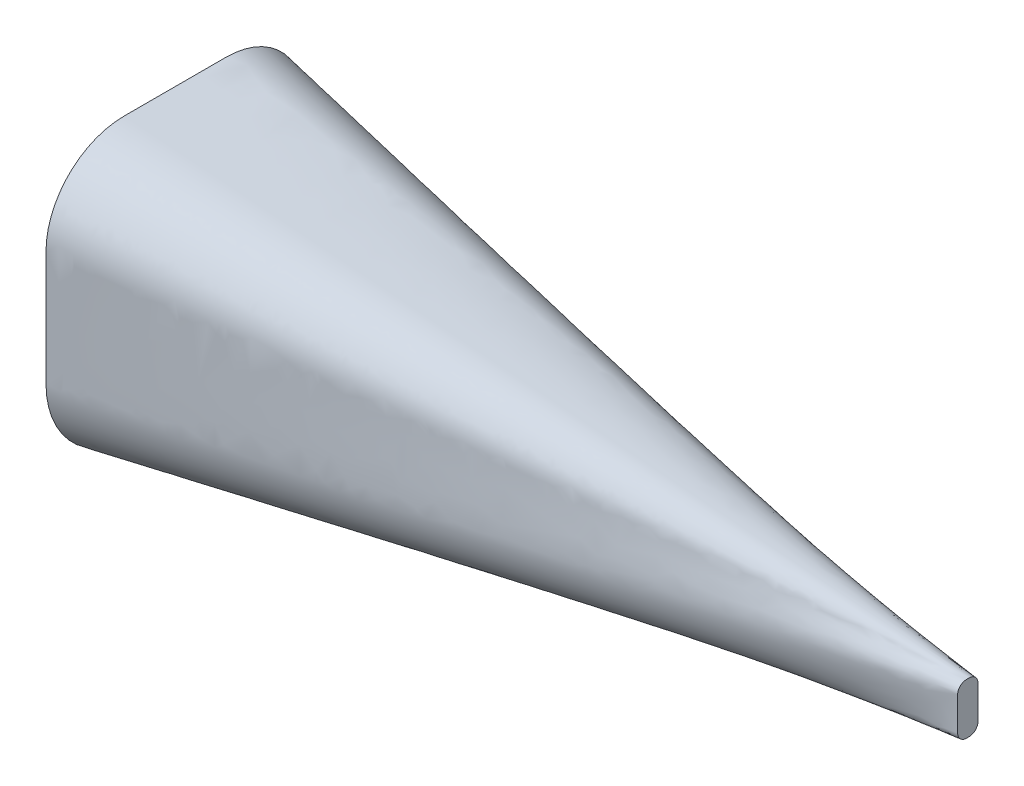
ISO-10303-21;
HEADER;
FILE_DESCRIPTION(('STEP AP214'),'2;1');
FILE_NAME('part.step','',(''),(''),'','','');
FILE_SCHEMA(('AUTOMOTIVE_DESIGN { 1 0 10303 214 1 1 1 1 }'));
ENDSEC;
DATA;
#1=APPLICATION_CONTEXT('core data for automotive mechanical design processes');
#2=APPLICATION_PROTOCOL_DEFINITION('international standard','automotive_design',2000,#1);
#3=PRODUCT_CONTEXT('',#1,'mechanical');
#4=PRODUCT('Part','Part','',(#3));
#5=PRODUCT_RELATED_PRODUCT_CATEGORY('part','',(#4));
#6=PRODUCT_DEFINITION_FORMATION('','',#4);
#7=PRODUCT_DEFINITION_CONTEXT('part definition',#1,'design');
#8=PRODUCT_DEFINITION('design','',#6,#7);
#9=PRODUCT_DEFINITION_SHAPE('','',#8);
#10=(LENGTH_UNIT() NAMED_UNIT(*) SI_UNIT(.MILLI.,.METRE.));
#11=(NAMED_UNIT(*) PLANE_ANGLE_UNIT() SI_UNIT($,.RADIAN.));
#12=(NAMED_UNIT(*) SI_UNIT($,.STERADIAN.) SOLID_ANGLE_UNIT());
#13=UNCERTAINTY_MEASURE_WITH_UNIT(LENGTH_MEASURE(1.E-05),#10,'distance_accuracy_value','');
#14=(GEOMETRIC_REPRESENTATION_CONTEXT(3) GLOBAL_UNCERTAINTY_ASSIGNED_CONTEXT((#13)) GLOBAL_UNIT_ASSIGNED_CONTEXT((#10,
#11,#12)) REPRESENTATION_CONTEXT('',''));
#15=CARTESIAN_POINT('',(0.,0.,0.));
#16=DIRECTION('',(0.,0.,1.));
#17=DIRECTION('',(1.,0.,0.));
#18=AXIS2_PLACEMENT_3D('',#15,#16,#17);
#19=CARTESIAN_POINT('',(311.404001016,-6.56399981681864,-0.88399890091182));
#20=DIRECTION('',(1.,0.,0.));
#21=DIRECTION('',(0.,0.,-1.));
#22=AXIS2_PLACEMENT_3D('',#19,#20,#21);
#23=PLANE('',#22);
#24=CARTESIAN_POINT('',(311.404001016,-6.56399981681864,-0.88399890091182));
#25=DIRECTION('',(1.,0.,0.));
#26=DIRECTION('',(0.,0.,-1.));
#27=AXIS2_PLACEMENT_3D('',#24,#25,#26);
#28=CIRCLE('',#27,3.5);
#29=CARTESIAN_POINT('',(311.404001016,-10.0639998168186,-0.88399890091182));
#30=VERTEX_POINT('',#29);
#31=CARTESIAN_POINT('',(311.404001016,-6.56399981683067,-4.38399890091182));
#32=VERTEX_POINT('',#31);
#33=EDGE_CURVE('E359',#30,#32,#28,.T.);
#34=ORIENTED_EDGE('',*,*,#33,.T.);
#35=DIRECTION('',(0.,1.,0.));
#36=VECTOR('',#35,1.);
#37=CARTESIAN_POINT('',(311.404001016,6.43600018318136,-4.38399890091182));
#38=LINE('',#37,#36);
#39=CARTESIAN_POINT('',(311.404001016,6.43600018317641,-4.38399890091182));
#40=VERTEX_POINT('',#39);
#41=EDGE_CURVE('E619',#32,#40,#38,.T.);
#42=ORIENTED_EDGE('',*,*,#41,.T.);
#43=CARTESIAN_POINT('',(311.404001016,6.43600018318136,-0.883998900911818));
#44=DIRECTION('',(1.,0.,0.));
#45=DIRECTION('',(0.,0.,1.));
#46=AXIS2_PLACEMENT_3D('',#43,#44,#45);
#47=CIRCLE('',#46,3.5);
#48=CARTESIAN_POINT('',(311.404001016,9.93600018318135,-0.88399890085726));
#49=VERTEX_POINT('',#48);
#50=EDGE_CURVE('E609',#40,#49,#47,.T.);
#51=ORIENTED_EDGE('',*,*,#50,.T.);
#52=DIRECTION('',(0.,0.,1.));
#53=VECTOR('',#52,1.);
#54=CARTESIAN_POINT('',(311.404001016,9.93600018318136,0.116001099088183));
#55=LINE('',#54,#53);
#56=CARTESIAN_POINT('',(311.404001016,9.93600018318136,0.11600109908024));
#57=VERTEX_POINT('',#56);
#58=EDGE_CURVE('E599',#49,#57,#55,.T.);
#59=ORIENTED_EDGE('',*,*,#58,.T.);
#60=CARTESIAN_POINT('',(311.404001016,6.43600018318136,0.116001099088182));
#61=DIRECTION('',(1.,0.,0.));
#62=DIRECTION('',(0.,0.,-1.));
#63=AXIS2_PLACEMENT_3D('',#60,#61,#62);
#64=CIRCLE('',#63,3.5);
#65=CARTESIAN_POINT('',(311.404001016,6.43600018334445,3.61600109908818));
#66=VERTEX_POINT('',#65);
#67=EDGE_CURVE('E589',#57,#66,#64,.T.);
#68=ORIENTED_EDGE('',*,*,#67,.T.);
#69=DIRECTION('',(0.,-1.,0.));
#70=VECTOR('',#69,1.);
#71=CARTESIAN_POINT('',(311.404001016,6.43600018318136,3.61600109908818));
#72=LINE('',#71,#70);
#73=CARTESIAN_POINT('',(311.404001016,-6.5639998168176,3.61600109908818));
#74=VERTEX_POINT('',#73);
#75=EDGE_CURVE('E579',#66,#74,#72,.T.);
#76=ORIENTED_EDGE('',*,*,#75,.T.);
#77=CARTESIAN_POINT('',(311.404001016,-6.56399981681864,0.11600109908818));
#78=DIRECTION('',(1.,0.,0.));
#79=DIRECTION('',(0.,0.,-1.));
#80=AXIS2_PLACEMENT_3D('',#77,#78,#79);
#81=CIRCLE('',#80,3.5);
#82=CARTESIAN_POINT('',(311.404001016,-10.0639998168186,0.11600109908818));
#83=VERTEX_POINT('',#82);
#84=EDGE_CURVE('E284',#74,#83,#81,.T.);
#85=ORIENTED_EDGE('',*,*,#84,.T.);
#86=DIRECTION('',(0.,0.,-1.));
#87=VECTOR('',#86,1.);
#88=CARTESIAN_POINT('',(311.404001016,-10.0639998168186,0.11600109908818));
#89=LINE('',#88,#87);
#90=EDGE_CURVE('E12',#83,#30,#89,.T.);
#91=ORIENTED_EDGE('',*,*,#90,.T.);
#92=EDGE_LOOP('',(#34,#42,#51,#59,#68,#76,#85,#91));
#93=FACE_BOUND('',#92,.T.);
#94=ADVANCED_FACE('F273',(#93),#23,.T.);
#95=CARTESIAN_POINT('',(0.,24.9360001831814,19.6160010990882));
#96=DIRECTION('',(-1.,0.,0.));
#97=DIRECTION('',(0.,0.,1.));
#98=AXIS2_PLACEMENT_3D('',#95,#96,#97);
#99=PLANE('',#98);
#100=CARTESIAN_POINT('',(0.,24.9360001831814,19.6160010990882));
#101=DIRECTION('',(1.,0.,0.));
#102=DIRECTION('',(0.,0.,1.));
#103=AXIS2_PLACEMENT_3D('',#100,#101,#102);
#104=CIRCLE('',#103,30.7);
#105=CARTESIAN_POINT('',(0.,55.6360001831814,19.6160010983524));
#106=VERTEX_POINT('',#105);
#107=CARTESIAN_POINT('',(0.,24.9360001831814,50.3160010990882));
#108=VERTEX_POINT('',#107);
#109=EDGE_CURVE('E351',#106,#108,#104,.T.);
#110=ORIENTED_EDGE('',*,*,#109,.F.);
#111=DIRECTION('',(0.,0.,1.));
#112=VECTOR('',#111,1.);
#113=CARTESIAN_POINT('',(0.,55.6360001831814,19.6160010990882));
#114=LINE('',#113,#112);
#115=CARTESIAN_POINT('',(0.,55.6360001831814,-20.3839989011873));
#116=VERTEX_POINT('',#115);
#117=EDGE_CURVE('E365',#116,#106,#114,.T.);
#118=ORIENTED_EDGE('',*,*,#117,.F.);
#119=CARTESIAN_POINT('',(0.,24.9360001831814,-20.3839989009118));
#120=DIRECTION('',(1.,0.,0.));
#121=DIRECTION('',(0.,0.,1.));
#122=AXIS2_PLACEMENT_3D('',#119,#120,#121);
#123=CIRCLE('',#122,30.7);
#124=CARTESIAN_POINT('',(0.,24.9360001828926,-51.0839989009118));
#125=VERTEX_POINT('',#124);
#126=EDGE_CURVE('E544',#125,#116,#123,.T.);
#127=ORIENTED_EDGE('',*,*,#126,.F.);
#128=DIRECTION('',(0.,1.,0.));
#129=VECTOR('',#128,1.);
#130=CARTESIAN_POINT('',(0.,24.9360001831814,-51.0839989009118));
#131=LINE('',#130,#129);
#132=CARTESIAN_POINT('',(0.,-20.0639998186042,-51.0839989009118));
#133=VERTEX_POINT('',#132);
#134=EDGE_CURVE('E534',#133,#125,#131,.T.);
#135=ORIENTED_EDGE('',*,*,#134,.F.);
#136=CARTESIAN_POINT('',(0.,-20.0639998168186,-15.3839989009118));
#137=DIRECTION('',(1.,0.,0.));
#138=DIRECTION('',(0.,0.,-1.));
#139=AXIS2_PLACEMENT_3D('',#136,#137,#138);
#140=CIRCLE('',#139,35.7);
#141=CARTESIAN_POINT('',(0.,-55.7639998168187,-15.3839989034915));
#142=VERTEX_POINT('',#141);
#143=EDGE_CURVE('E524',#142,#133,#140,.T.);
#144=ORIENTED_EDGE('',*,*,#143,.F.);
#145=DIRECTION('',(0.,0.,-1.));
#146=VECTOR('',#145,1.);
#147=CARTESIAN_POINT('',(0.,-55.7639998168186,-0.883998900911824));
#148=LINE('',#147,#146);
#149=CARTESIAN_POINT('',(0.,-55.7639998168187,-0.883998900911825));
#150=VERTEX_POINT('',#149);
#151=EDGE_CURVE('E514',#150,#142,#148,.T.);
#152=ORIENTED_EDGE('',*,*,#151,.F.);
#153=DIRECTION('',(0.,0.,-1.));
#154=VECTOR('',#153,1.);
#155=CARTESIAN_POINT('',(0.,-55.7639998168186,0.116001099088176));
#156=LINE('',#155,#154);
#157=CARTESIAN_POINT('',(0.,-55.7639998168186,0.116001099088176));
#158=VERTEX_POINT('',#157);
#159=EDGE_CURVE('E504',#158,#150,#156,.T.);
#160=ORIENTED_EDGE('',*,*,#159,.F.);
#161=DIRECTION('',(0.,0.,-1.));
#162=VECTOR('',#161,1.);
#163=CARTESIAN_POINT('',(0.,-55.7639998168186,14.6160010990882));
#164=LINE('',#163,#162);
#165=CARTESIAN_POINT('',(0.,-55.7639998168187,14.6160011003056));
#166=VERTEX_POINT('',#165);
#167=EDGE_CURVE('E497',#166,#158,#164,.T.);
#168=ORIENTED_EDGE('',*,*,#167,.F.);
#169=CARTESIAN_POINT('',(0.,-20.0639998168186,14.6160010990882));
#170=DIRECTION('',(1.,0.,0.));
#171=DIRECTION('',(0.,0.,-1.));
#172=AXIS2_PLACEMENT_3D('',#169,#170,#171);
#173=CIRCLE('',#172,35.7);
#174=CARTESIAN_POINT('',(0.,-20.0639998168186,50.3160010990882));
#175=VERTEX_POINT('',#174);
#176=EDGE_CURVE('E354',#175,#166,#173,.T.);
#177=ORIENTED_EDGE('',*,*,#176,.F.);
#178=DIRECTION('',(0.,-1.,0.));
#179=VECTOR('',#178,1.);
#180=CARTESIAN_POINT('',(0.,24.9360001831814,50.3160010990882));
#181=LINE('',#180,#179);
#182=EDGE_CURVE('E346',#108,#175,#181,.T.);
#183=ORIENTED_EDGE('',*,*,#182,.F.);
#184=EDGE_LOOP('',(#110,#118,#127,#135,#144,#152,#160,#168,#177,#183));
#185=FACE_BOUND('',#184,.T.);
#186=ADVANCED_FACE('F349',(#185),#99,.T.);
#187=CARTESIAN_POINT('',(0.,55.6360001831814,19.6160010918265));
#188=CARTESIAN_POINT('',(311.404001016,9.93600018318135,-0.883998900376984));
#189=CARTESIAN_POINT('',(0.,55.6360001831814,21.1172626836924));
#190=CARTESIAN_POINT('',(311.404001016,9.93600018318135,-0.773428767989582));
#191=CARTESIAN_POINT('',(0.,55.4179480152652,24.3292082338783));
#192=CARTESIAN_POINT('',(311.404001016,9.93600018318136,-0.650294084213661));
#193=CARTESIAN_POINT('',(0.,54.113023077654,29.7822612987783));
#194=CARTESIAN_POINT('',(311.404001016,9.93600018318136,-0.593014915437986));
#195=CARTESIAN_POINT('',(0.,51.8489970573362,34.698368719816));
#196=CARTESIAN_POINT('',(311.404001016,9.93600018318136,-0.512639747767226));
#197=CARTESIAN_POINT('',(0.,49.1972574457168,38.5392431624443));
#198=CARTESIAN_POINT('',(311.404001016,9.93600018318135,-0.439155094986588));
#199=CARTESIAN_POINT('',(0.,46.8252125563963,41.2429437548197));
#200=CARTESIAN_POINT('',(311.404001016,9.93600018318135,-0.382049595471743));
#201=CARTESIAN_POINT('',(0.,44.1378804877398,43.6592013932662));
#202=CARTESIAN_POINT('',(311.404001016,9.93600018318135,-0.325552335420178));
#203=CARTESIAN_POINT('',(0.,41.2529821052288,45.6972140012147));
#204=CARTESIAN_POINT('',(311.404001016,9.93600018318136,-0.271558327443118));
#205=CARTESIAN_POINT('',(0.,38.2936695892195,47.3228344516589));
#206=CARTESIAN_POINT('',(311.404001016,9.93600018318136,-0.221962584151784));
#207=CARTESIAN_POINT('',(0.,34.3783664426568,48.9553005208935));
#208=CARTESIAN_POINT('',(311.404001016,9.93600018318136,-0.164225962825938));
#209=CARTESIAN_POINT('',(0.,29.741936168367,50.0906970161156));
#210=CARTESIAN_POINT('',(311.404001016,9.93600018318136,-0.112525910939065));
#211=CARTESIAN_POINT('',(0.,26.4661446776803,50.3160010990882));
#212=CARTESIAN_POINT('',(311.404001016,9.93600018318136,0.00934817448254277));
#213=CARTESIAN_POINT('',(0.,20.2276685893745,50.3160010990882));
#214=CARTESIAN_POINT('',(311.404001016,9.93600018318136,0.44417750972343));
#215=CARTESIAN_POINT('',(0.,11.4440294171231,50.3160010990882));
#216=CARTESIAN_POINT('',(311.404001016001,9.84542731613543,1.15404075861435));
#217=CARTESIAN_POINT('',(0.,1.71873522188847,50.3160010990882));
#218=CARTESIAN_POINT('',(311.404001015999,9.37338144474158,2.11783336469917));
#219=CARTESIAN_POINT('',(0.,-5.46136570008985,50.3160010990882));
#220=CARTESIAN_POINT('',(311.404001016001,8.70102246567916,2.82003225085521));
#221=CARTESIAN_POINT('',(0.,-10.5751869493449,50.3160010990882));
#222=CARTESIAN_POINT('',(311.404001016,8.04959463818193,3.25653805968334));
#223=CARTESIAN_POINT('',(0.,-15.4465665312474,50.3160010990882));
#224=CARTESIAN_POINT('',(311.404001016,7.27358552322974,3.54902387999788));
#225=CARTESIAN_POINT('',(0.,-18.5469762987374,50.3160010990882));
#226=CARTESIAN_POINT('',(311.404001016,6.71362475536981,3.61600109908818));
#227=CARTESIAN_POINT('',(0.,-22.7585358173125,50.3160010990882));
#228=CARTESIAN_POINT('',(311.404001016,5.94288362618528,3.61600109908818));
#229=CARTESIAN_POINT('',(0.,-27.8862255427362,49.7124887519101));
#230=CARTESIAN_POINT('',(311.404001016,4.93444238733296,3.61600109908818));
#231=CARTESIAN_POINT('',(0.,-34.7753841898454,47.4001178820949));
#232=CARTESIAN_POINT('',(311.404001016,3.36223677098733,3.61600109908818));
#233=CARTESIAN_POINT('',(0.,-40.8202542089141,43.9301233511671));
#234=CARTESIAN_POINT('',(311.404001016,1.73756801308794,3.61600109908818));
#235=CARTESIAN_POINT('',(0.,-45.9668730352458,39.488913611288));
#236=CARTESIAN_POINT('',(311.404001016,0.0763936015578786,3.61600109908818));
#237=CARTESIAN_POINT('',(0.,-50.1488466266007,34.2218590494992));
#238=CARTESIAN_POINT('',(311.404001016,-1.60532897567978,3.61600109908818));
#239=CARTESIAN_POINT('',(0.,-53.2867297095918,28.2548589620298));
#240=CARTESIAN_POINT('',(311.404001016,-3.28701961648492,3.61600109908818));
#241=CARTESIAN_POINT('',(0.,-55.2811609496783,21.702237884448));
#242=CARTESIAN_POINT('',(311.404001016,-4.94809821871743,3.61600109908818));
#243=CARTESIAN_POINT('',(0.,-55.7639998168186,17.017775097319));
#244=CARTESIAN_POINT('',(311.404001016,-6.0311777815924,3.61600109908818));
#245=CARTESIAN_POINT('',(0.,-55.7639998168186,13.5380967212564));
#246=CARTESIAN_POINT('',(311.404001016,-6.80312772595073,3.61600109908818));
#247=CARTESIAN_POINT('',(0.,-55.7639998168187,11.2768080474479));
#248=CARTESIAN_POINT('',(311.404001016,-7.26100596733774,3.56758981031648));
#249=CARTESIAN_POINT('',(0.,-55.7639998168186,7.61480858879069));
#250=CARTESIAN_POINT('',(311.404001016,-7.89259839105827,3.37578598045451));
#251=CARTESIAN_POINT('',(0.,-55.7639998168187,3.81633878855292));
#252=CARTESIAN_POINT('',(311.404001016,-8.46851579675643,3.07618088471527));
#253=CARTESIAN_POINT('',(0.,-55.7639998168186,1.32433443242151));
#254=CARTESIAN_POINT('',(311.404001016,-8.81261491286521,2.80723970314582));
#255=CARTESIAN_POINT('',(0.,-55.7639998168187,0.0326677657548427));
#256=CARTESIAN_POINT('',(311.404001016,-8.98431848144502,2.64429910058508));
#257=CARTESIAN_POINT('',(0.,-55.7639998168187,-0.133998900911827));
#258=CARTESIAN_POINT('',(311.404001016,-9.00633617342354,2.62312949853887));
#259=CARTESIAN_POINT('',(0.,-55.7639998168186,-0.383998900911818));
#260=CARTESIAN_POINT('',(311.404001016,-9.03894422915591,2.59094551142546));
#261=CARTESIAN_POINT('',(0.,-55.7639998168187,-0.633998900911825));
#262=CARTESIAN_POINT('',(311.404001016,-9.07112821626934,2.55833745569306));
#263=CARTESIAN_POINT('',(0.,-55.7639998168187,-0.800665567578492));
#264=CARTESIAN_POINT('',(311.404001016,-9.09229781831555,2.53631976371455));
#265=CARTESIAN_POINT('',(0.,-55.7639998168186,-1.48816556757849));
#266=CARTESIAN_POINT('',(311.404001016,-9.17902426811897,2.44492915457553));
#267=CARTESIAN_POINT('',(0.,-55.7639998168186,-2.64594909213407));
#268=CARTESIAN_POINT('',(311.404001016,-9.33282919017626,2.26721981685514));
#269=CARTESIAN_POINT('',(0.,-55.7639998168186,-4.27674955636454));
#270=CARTESIAN_POINT('',(311.404001016,-9.55229902720466,1.95287914777894));
#271=CARTESIAN_POINT('',(0.,-55.7639998168186,-5.84744980172239));
#272=CARTESIAN_POINT('',(311.404001016,-9.73926747978968,1.60436228664293));
#273=CARTESIAN_POINT('',(0.,-55.7639998168187,-7.4353910530262));
#274=CARTESIAN_POINT('',(311.404001016,-9.88392271665008,1.2484337203653));
#275=CARTESIAN_POINT('',(0.,-55.7639998168187,-9.11791453509453));
#276=CARTESIAN_POINT('',(311.404001016,-9.99168738613878,0.858507811236911));
#277=CARTESIAN_POINT('',(0.,-55.7639998168186,-10.8803913738157));
#278=CARTESIAN_POINT('',(311.404001016,-10.0450002159359,0.516236004726559));
#279=CARTESIAN_POINT('',(0.,-55.7639998168186,-12.7081926950781));
#280=CARTESIAN_POINT('',(311.404001016,-10.0611776034099,0.289326506497139));
#281=CARTESIAN_POINT('',(0.,-55.7639998168186,-14.3561730584171));
#282=CARTESIAN_POINT('',(311.404001016,-10.0639998168186,0.169262180595435));
#283=CARTESIAN_POINT('',(0.,-55.7639998168186,-17.2968992487447));
#284=CARTESIAN_POINT('',(311.404001016,-10.0639998168186,0.0168761900834857));
#285=CARTESIAN_POINT('',(0.,-55.4583494775269,-21.3655112735591));
#286=CARTESIAN_POINT('',(311.404001016,-10.0639998168186,-0.102408407101843));
#287=CARTESIAN_POINT('',(0.,-53.6982463289418,-28.0844329416233));
#288=CARTESIAN_POINT('',(311.404001016,-10.0639998168186,-0.173605077236205));
#289=CARTESIAN_POINT('',(0.,-50.8194819575962,-33.8540397142448));
#290=CARTESIAN_POINT('',(311.404001016,-10.0639998168186,-0.250798311668947));
#291=CARTESIAN_POINT('',(0.,-47.6426893424026,-38.1721979502441));
#292=CARTESIAN_POINT('',(311.404001016,-10.0639998168186,-0.320394089512489));
#293=CARTESIAN_POINT('',(0.,-44.8889685746104,-41.1464851432478));
#294=CARTESIAN_POINT('',(311.404001016,-10.0639998168186,-0.375792414220043));
#295=CARTESIAN_POINT('',(0.,-41.8447235820667,-43.761885433236));
#296=CARTESIAN_POINT('',(311.404001016,-10.0639998168186,-0.433673126428715));
#297=CARTESIAN_POINT('',(0.,-37.5415098569934,-46.6995818968287));
#298=CARTESIAN_POINT('',(311.404001016,-10.0639998168186,-0.509364525064788));
#299=CARTESIAN_POINT('',(0.,-31.9868174324483,-49.2706206225587));
#300=CARTESIAN_POINT('',(311.404001016,-10.0639998168186,-0.592211988449006));
#301=CARTESIAN_POINT('',(0.,-25.6660594216538,-50.8155136526516));
#302=CARTESIAN_POINT('',(311.404001016,-10.0639998168186,-0.644045682790802));
#303=CARTESIAN_POINT('',(0.,-21.8576140973058,-51.0839989009118));
#304=CARTESIAN_POINT('',(311.404001016,-10.0639998168186,-0.768695969098339));
#305=CARTESIAN_POINT('',(0.,-15.2281093289188,-51.0839989009118));
#306=CARTESIAN_POINT('',(311.404001016,-10.0639998168186,-1.19487529724395));
#307=CARTESIAN_POINT('',(0.,-6.18492657570974,-51.0839989009118));
#308=CARTESIAN_POINT('',(311.404001016,-9.98323284143564,-1.87089713924939));
#309=CARTESIAN_POINT('',(0.,3.64233154651016,-51.0839989009118));
#310=CARTESIAN_POINT('',(311.404001016,-9.54469698839071,-2.8188230453017));
#311=CARTESIAN_POINT('',(0.,10.7736490794464,-51.0839989009118));
#312=CARTESIAN_POINT('',(311.404001016001,-8.88867763231187,-3.53789190522531));
#313=CARTESIAN_POINT('',(0.,15.7922626658632,-51.0839989009118));
#314=CARTESIAN_POINT('',(311.404001016,-8.23321899274353,-3.99734018126762));
#315=CARTESIAN_POINT('',(0.,20.5163716081288,-51.0839989009118));
#316=CARTESIAN_POINT('',(311.404001016,-7.43339390519153,-4.31202883742054));
#317=CARTESIAN_POINT('',(0.,23.4889953323535,-51.0839989009118));
#318=CARTESIAN_POINT('',(311.404001016,-6.85112058253857,-4.38399890091182));
#319=CARTESIAN_POINT('',(0.,26.1546529005174,-51.0839989009118));
#320=CARTESIAN_POINT('',(311.404001016,-6.32218963511724,-4.38399890091182));
#321=CARTESIAN_POINT('',(0.,28.4817256623609,-50.9408885664246));
#322=CARTESIAN_POINT('',(311.404001016,-5.83025591187748,-4.38399890091182));
#323=CARTESIAN_POINT('',(0.,32.7792952809979,-50.1981433817158));
#324=CARTESIAN_POINT('',(311.404001016,-4.81484174494996,-4.38399890091182));
#325=CARTESIAN_POINT('',(0.,37.5843721898901,-48.5617509881795));
#326=CARTESIAN_POINT('',(311.404001016,-3.48962403338774,-4.38399890091182));
#327=CARTESIAN_POINT('',(0.,42.5884686274559,-45.7124224067459));
#328=CARTESIAN_POINT('',(311.404001016,-1.82008308826747,-4.38399890091182));
#329=CARTESIAN_POINT('',(0.,46.8739702928369,-42.0988809145143));
#330=CARTESIAN_POINT('',(311.404001016,-0.107184827939057,-4.38399890091182));
#331=CARTESIAN_POINT('',(0.,50.4350768640074,-37.786214252097));
#332=CARTESIAN_POINT('',(311.404001016,1.61314837156005,-4.38399890091182));
#333=CARTESIAN_POINT('',(0.,53.2167417995589,-32.7915381845093));
#334=CARTESIAN_POINT('',(311.404001016,3.30181685445948,-4.38399890091182));
#335=CARTESIAN_POINT('',(0.,54.7944204856028,-28.0384993655287));
#336=CARTESIAN_POINT('',(311.404001016,4.65007027990065,-4.38399890091182));
#337=CARTESIAN_POINT('',(0.,55.5017722617085,-23.8264074817928));
#338=CARTESIAN_POINT('',(311.404001016,5.68614091235411,-4.38399890091182));
#339=CARTESIAN_POINT('',(0.,55.6360001831814,-21.5629624329842));
#340=CARTESIAN_POINT('',(311.404001016,6.18880720566194,-4.38399890091182));
#341=CARTESIAN_POINT('',(0.,55.6360001831814,-19.0659490123736));
#342=CARTESIAN_POINT('',(311.404001016,6.7123553573353,-4.38399890091182));
#343=CARTESIAN_POINT('',(0.,55.6360001831814,-16.3692752161201));
#344=CARTESIAN_POINT('',(311.404001015999,7.27416502378999,-4.3175422464023));
#345=CARTESIAN_POINT('',(0.,55.6360001831813,-12.1196680489578));
#346=CARTESIAN_POINT('',(311.404001016001,8.05935386639479,-4.02043208447738));
#347=CARTESIAN_POINT('',(0.,55.6360001831814,-7.64258999376294));
#348=CARTESIAN_POINT('',(311.404001015999,8.71702988805892,-3.57539172668351));
#349=CARTESIAN_POINT('',(0.,55.6360001831814,-1.32497186118115));
#350=CARTESIAN_POINT('',(311.404001016001,9.3892071313126,-2.8630213764027));
#351=CARTESIAN_POINT('',(0.,55.6360001831814,7.30905130567236));
#352=CARTESIAN_POINT('',(311.404001016,9.85011673715131,-1.90030919630572));
#353=CARTESIAN_POINT('',(0.,55.6360001831814,15.2665703517827));
#354=CARTESIAN_POINT('',(311.404001016,9.93600018318136,-1.20434089496485));
#355=CARTESIAN_POINT('',(0.,55.6360001831814,19.6160010918265));
#356=CARTESIAN_POINT('',(311.404001016,9.93600018318135,-0.883998900376984));
#357=B_SPLINE_SURFACE_WITH_KNOTS('',3,1,((#187,#188),(#189,#190),(#191,#192),(#193,#194),(#195,
#196),(#197,#198),(#199,#200),(#201,#202),(#203,#204),(#205,#206),(#207,#208),(#209,#210),(#211,
#212),(#213,#214),(#215,#216),(#217,#218),(#219,#220),(#221,#222),(#223,#224),(#225,#226),(#227,
#228),(#229,#230),(#231,#232),(#233,#234),(#235,#236),(#237,#238),(#239,#240),(#241,#242),(#243,
#244),(#245,#246),(#247,#248),(#249,#250),(#251,#252),(#253,#254),(#255,#256),(#257,#258),(#259,
#260),(#261,#262),(#263,#264),(#265,#266),(#267,#268),(#269,#270),(#271,#272),(#273,#274),(#275,
#276),(#277,#278),(#279,#280),(#281,#282),(#283,#284),(#285,#286),(#287,#288),(#289,#290),(#291,
#292),(#293,#294),(#295,#296),(#297,#298),(#299,#300),(#301,#302),(#303,#304),(#305,#306),(#307,
#308),(#309,#310),(#311,#312),(#313,#314),(#315,#316),(#317,#318),(#319,#320),(#321,#322),(#323,
#324),(#325,#326),(#327,#328),(#329,#330),(#331,#332),(#333,#334),(#335,#336),(#337,#338),(#339,
#340),(#341,#342),(#343,#344),(#345,#346),(#347,#348),(#349,#350),(#351,#352),(#353,#354),(#355,
#356)),.UNSPECIFIED.,.T.,.F.,.F.,(4,1,1,1,1,1,1,1,1,1,1,2,1,1,1,1,1,2,1,1,1,1,1,1,1,2,1,1,1,2,1,
1,1,2,1,1,1,1,1,1,1,2,1,1,1,1,1,1,1,1,1,2,1,1,1,1,1,2,1,1,1,1,1,1,1,1,1,2,1,1,1,1,1,4),(2,2),
(0.,0.00942697424055039,0.0188539484811008,0.0282809227216512,0.0329944098419264,
0.0377078969622016,0.0424213840824767,0.0471348712027519,0.0518483583230271,0.0565618454433023,
0.0659888196838527,0.0754157939244031,0.104423067761325,0.133430341598246,0.147933978516707,
0.162437615435167,0.176941252353628,0.191444889272089,0.21720623812619,0.242967586980291,
0.268728935834393,0.294490284688494,0.320251633542595,0.346012982396696,0.371774331250798,
0.397535680104899,0.40909724690863,0.420658813712361,0.432220380516092,0.443781947319823,
0.444579296754563,0.445376646189303,0.446173995624043,0.446971345058783,0.452752128460649,
0.458532911862515,0.46431369526438,0.470094478666246,0.475875262068111,0.481656045469977,
0.487436828871842,0.493217612273708,0.503976305230178,0.514734998186648,0.525493691143119,
0.530873037621354,0.536252384099589,0.541631730577824,0.547011077056059,0.557769770012529,
0.568528462968999,0.57928715592547,0.608294429762391,0.637301703599312,0.651805340517773,
0.666308977436234,0.680812614354695,0.695316251273155,0.707531066342246,0.719745881411337,
0.744175511549518,0.768605141687699,0.793034771825881,0.817464401964062,0.841894032102244,
0.866323662240425,0.878538477309516,0.890753292378607,0.904409130831281,0.918064969283955,
0.931720807736629,0.945376646189303,0.972688323094652,1.),(0.,1.),.UNSPECIFIED.);
#358=ORIENTED_EDGE('',*,*,#182,.T.);
#359=ORIENTED_EDGE('',*,*,#176,.T.);
#360=ORIENTED_EDGE('',*,*,#167,.T.);
#361=ORIENTED_EDGE('',*,*,#159,.T.);
#362=ORIENTED_EDGE('',*,*,#151,.T.);
#363=ORIENTED_EDGE('',*,*,#143,.T.);
#364=ORIENTED_EDGE('',*,*,#134,.T.);
#365=ORIENTED_EDGE('',*,*,#126,.T.);
#366=ORIENTED_EDGE('',*,*,#117,.T.);
#367=ORIENTED_EDGE('',*,*,#109,.T.);
#368=EDGE_LOOP('',(#358,#359,#360,#361,#362,#363,#364,#365,#366,#367));
#369=FACE_BOUND('',#368,.T.);
#370=ORIENTED_EDGE('',*,*,#84,.F.);
#371=ORIENTED_EDGE('',*,*,#75,.F.);
#372=ORIENTED_EDGE('',*,*,#67,.F.);
#373=ORIENTED_EDGE('',*,*,#58,.F.);
#374=ORIENTED_EDGE('',*,*,#50,.F.);
#375=ORIENTED_EDGE('',*,*,#41,.F.);
#376=ORIENTED_EDGE('',*,*,#33,.F.);
#377=ORIENTED_EDGE('',*,*,#90,.F.);
#378=EDGE_LOOP('',(#370,#371,#372,#373,#374,#375,#376,#377));
#379=FACE_BOUND('',#378,.T.);
#380=ADVANCED_FACE('F364',(#369,#379),#357,.T.);
#381=CLOSED_SHELL('',(#94,#186,#380));
#382=MANIFOLD_SOLID_BREP('B2',#381);
#383=ADVANCED_BREP_SHAPE_REPRESENTATION('',(#18,#382),#14);
#384=SHAPE_DEFINITION_REPRESENTATION(#9,#383);
ENDSEC;
END-ISO-10303-21;
